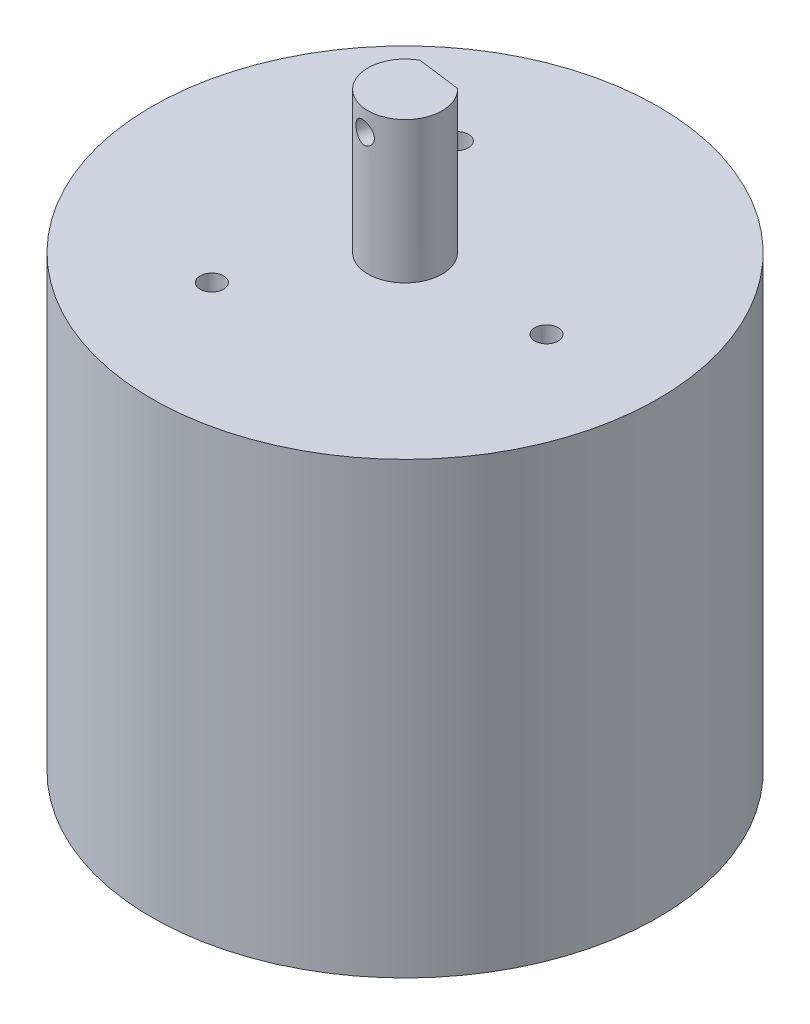
ISO-10303-21;
HEADER;
FILE_DESCRIPTION(('STEP AP214'),'2;1');
FILE_NAME('part.step','',(''),(''),'','','');
FILE_SCHEMA(('AUTOMOTIVE_DESIGN { 1 0 10303 214 1 1 1 1 }'));
ENDSEC;
DATA;
#1=APPLICATION_CONTEXT('core data for automotive mechanical design processes');
#2=APPLICATION_PROTOCOL_DEFINITION('international standard','automotive_design',2000,#1);
#3=PRODUCT_CONTEXT('',#1,'mechanical');
#4=PRODUCT('Part','Part','',(#3));
#5=PRODUCT_RELATED_PRODUCT_CATEGORY('part','',(#4));
#6=PRODUCT_DEFINITION_FORMATION('','',#4);
#7=PRODUCT_DEFINITION_CONTEXT('part definition',#1,'design');
#8=PRODUCT_DEFINITION('design','',#6,#7);
#9=PRODUCT_DEFINITION_SHAPE('','',#8);
#10=(LENGTH_UNIT() NAMED_UNIT(*) SI_UNIT(.MILLI.,.METRE.));
#11=(NAMED_UNIT(*) PLANE_ANGLE_UNIT() SI_UNIT($,.RADIAN.));
#12=(NAMED_UNIT(*) SI_UNIT($,.STERADIAN.) SOLID_ANGLE_UNIT());
#13=UNCERTAINTY_MEASURE_WITH_UNIT(LENGTH_MEASURE(1.E-05),#10,'distance_accuracy_value','');
#14=(GEOMETRIC_REPRESENTATION_CONTEXT(3) GLOBAL_UNCERTAINTY_ASSIGNED_CONTEXT((#13)) GLOBAL_UNIT_ASSIGNED_CONTEXT((#10,
#11,#12)) REPRESENTATION_CONTEXT('',''));
#15=CARTESIAN_POINT('',(0.,0.,0.));
#16=DIRECTION('',(0.,0.,1.));
#17=DIRECTION('',(1.,0.,0.));
#18=AXIS2_PLACEMENT_3D('',#15,#16,#17);
#19=CARTESIAN_POINT('',(-55.40494724416,-71.37599085876,49.5531694411));
#20=DIRECTION('',(0.,1.,0.));
#21=DIRECTION('',(-0.127904900041319,0.,0.991786436963836));
#22=AXIS2_PLACEMENT_3D('',#19,#20,#21);
#23=PLANE('',#22);
#24=CARTESIAN_POINT('',(-33.24092982825,-71.3759908587599,73.92100664979));
#25=DIRECTION('',(0.,1.,0.));
#26=DIRECTION('',(0.,0.,1.));
#27=AXIS2_PLACEMENT_3D('',#24,#25,#26);
#28=CIRCLE('',#27,1.64999999999993);
#29=CARTESIAN_POINT('',(-33.24092982825,-71.3759908587599,75.5710066497899));
#30=VERTEX_POINT('',#29);
#31=EDGE_CURVE('E228',#30,#30,#28,.F.);
#32=ORIENTED_EDGE('',*,*,#31,.F.);
#33=EDGE_LOOP('',(#32));
#34=FACE_BOUND('',#33,.T.);
#35=CARTESIAN_POINT('',(-3.240929828247,-71.3759908587599,91.24151472548));
#36=DIRECTION('',(0.,1.,0.));
#37=DIRECTION('',(0.,0.,1.));
#38=AXIS2_PLACEMENT_3D('',#35,#36,#37);
#39=CIRCLE('',#38,1.64999999999982);
#40=CARTESIAN_POINT('',(-3.240929828247,-71.3759908587599,92.8915147254798));
#41=VERTEX_POINT('',#40);
#42=EDGE_CURVE('E232',#41,#41,#39,.F.);
#43=ORIENTED_EDGE('',*,*,#42,.F.);
#44=EDGE_LOOP('',(#43));
#45=FACE_BOUND('',#44,.T.);
#46=CARTESIAN_POINT('',(-33.24092982825,-71.3759908587599,108.5620228012));
#47=DIRECTION('',(0.,1.,0.));
#48=DIRECTION('',(0.,0.,1.));
#49=AXIS2_PLACEMENT_3D('',#46,#47,#48);
#50=CIRCLE('',#49,1.65000000000984);
#51=CARTESIAN_POINT('',(-33.24092982825,-71.3759908587599,110.21202280121));
#52=VERTEX_POINT('',#51);
#53=EDGE_CURVE('E220',#52,#52,#50,.F.);
#54=ORIENTED_EDGE('',*,*,#53,.F.);
#55=EDGE_LOOP('',(#54));
#56=FACE_BOUND('',#55,.T.);
#57=CARTESIAN_POINT('',(-23.24092982825,-71.375990858758,91.24151472548));
#58=DIRECTION('',(0.,-1.,0.));
#59=DIRECTION('',(0.,0.,-1.));
#60=AXIS2_PLACEMENT_3D('',#57,#58,#59);
#61=CIRCLE('',#60,35.800000000006);
#62=CARTESIAN_POINT('',(-23.24092982825,-71.375990858758,55.441514725474));
#63=VERTEX_POINT('',#62);
#64=EDGE_CURVE('E20',#63,#63,#61,.T.);
#65=ORIENTED_EDGE('',*,*,#64,.T.);
#66=EDGE_LOOP('',(#65));
#67=FACE_BOUND('',#66,.T.);
#68=ADVANCED_FACE('F16',(#34,#45,#56,#67),#23,.F.);
#69=CARTESIAN_POINT('',(-23.24092982825,-7.87599085876005,91.24151472548));
#70=DIRECTION('',(0.,-1.,0.));
#71=DIRECTION('',(0.,0.,-1.));
#72=AXIS2_PLACEMENT_3D('',#69,#70,#71);
#73=CYLINDRICAL_SURFACE('',#72,35.800000000006);
#74=ORIENTED_EDGE('',*,*,#64,.F.);
#75=EDGE_LOOP('',(#74));
#76=FACE_BOUND('',#75,.T.);
#77=CARTESIAN_POINT('',(-23.24092982825,-7.87599085876005,91.24151472548));
#78=DIRECTION('',(0.,-1.,0.));
#79=DIRECTION('',(0.,0.,-1.));
#80=AXIS2_PLACEMENT_3D('',#77,#78,#79);
#81=CIRCLE('',#80,35.800000000006);
#82=CARTESIAN_POINT('',(-23.24092982825,-7.87599085876005,55.441514725474));
#83=VERTEX_POINT('',#82);
#84=EDGE_CURVE('E231',#83,#83,#81,.F.);
#85=ORIENTED_EDGE('',*,*,#84,.F.);
#86=EDGE_LOOP('',(#85));
#87=FACE_BOUND('',#86,.T.);
#88=ADVANCED_FACE('F100',(#76,#87),#73,.T.);
#89=CARTESIAN_POINT('',(-33.24092982825,-71.3759908587599,108.5620228012));
#90=DIRECTION('',(0.,1.,0.));
#91=DIRECTION('',(0.,0.,1.));
#92=AXIS2_PLACEMENT_3D('',#89,#90,#91);
#93=CYLINDRICAL_SURFACE('',#92,1.65000000000984);
#94=CARTESIAN_POINT('',(-33.24092982825,-7.87599085876202,108.5620228012));
#95=DIRECTION('',(0.,1.,0.));
#96=DIRECTION('',(0.,0.,1.));
#97=AXIS2_PLACEMENT_3D('',#94,#95,#96);
#98=CIRCLE('',#97,1.65000000000984);
#99=CARTESIAN_POINT('',(-33.24092982825,-7.87599085876202,110.21202280121));
#100=VERTEX_POINT('',#99);
#101=EDGE_CURVE('E235',#100,#100,#98,.F.);
#102=ORIENTED_EDGE('',*,*,#101,.F.);
#103=EDGE_LOOP('',(#102));
#104=FACE_BOUND('',#103,.T.);
#105=ORIENTED_EDGE('',*,*,#53,.T.);
#106=EDGE_LOOP('',(#105));
#107=FACE_BOUND('',#106,.T.);
#108=ADVANCED_FACE('F96',(#104,#107),#93,.F.);
#109=CARTESIAN_POINT('',(-3.240929828247,-71.3759908587599,91.24151472548));
#110=DIRECTION('',(0.,1.,0.));
#111=DIRECTION('',(0.,0.,1.));
#112=AXIS2_PLACEMENT_3D('',#109,#110,#111);
#113=CYLINDRICAL_SURFACE('',#112,1.64999999999982);
#114=CARTESIAN_POINT('',(-3.240929828247,-7.87599085876202,91.24151472548));
#115=DIRECTION('',(0.,1.,0.));
#116=DIRECTION('',(0.,0.,1.));
#117=AXIS2_PLACEMENT_3D('',#114,#115,#116);
#118=CIRCLE('',#117,1.64999999999982);
#119=CARTESIAN_POINT('',(-3.240929828247,-7.87599085876202,92.8915147254798));
#120=VERTEX_POINT('',#119);
#121=EDGE_CURVE('E223',#120,#120,#118,.F.);
#122=ORIENTED_EDGE('',*,*,#121,.F.);
#123=EDGE_LOOP('',(#122));
#124=FACE_BOUND('',#123,.T.);
#125=ORIENTED_EDGE('',*,*,#42,.T.);
#126=EDGE_LOOP('',(#125));
#127=FACE_BOUND('',#126,.T.);
#128=ADVANCED_FACE('F92',(#124,#127),#113,.F.);
#129=CARTESIAN_POINT('',(-33.24092982825,-71.3759908587599,73.92100664979));
#130=DIRECTION('',(0.,1.,0.));
#131=DIRECTION('',(0.,0.,1.));
#132=AXIS2_PLACEMENT_3D('',#129,#130,#131);
#133=CYLINDRICAL_SURFACE('',#132,1.64999999999993);
#134=CARTESIAN_POINT('',(-33.24092982825,-7.87599085876202,73.92100664979));
#135=DIRECTION('',(0.,1.,0.));
#136=DIRECTION('',(0.,0.,1.));
#137=AXIS2_PLACEMENT_3D('',#134,#135,#136);
#138=CIRCLE('',#137,1.64999999999993);
#139=CARTESIAN_POINT('',(-33.24092982825,-7.87599085876202,75.5710066497899));
#140=VERTEX_POINT('',#139);
#141=EDGE_CURVE('E57',#140,#140,#138,.F.);
#142=ORIENTED_EDGE('',*,*,#141,.F.);
#143=EDGE_LOOP('',(#142));
#144=FACE_BOUND('',#143,.T.);
#145=ORIENTED_EDGE('',*,*,#31,.T.);
#146=EDGE_LOOP('',(#145));
#147=FACE_BOUND('',#146,.T.);
#148=ADVANCED_FACE('F89',(#144,#147),#133,.F.);
#149=CARTESIAN_POINT('',(-25.76237683561,1.12400914124,85.46406127143));
#150=DIRECTION('',(0.,1.,0.));
#151=DIRECTION('',(-0.127904900040745,0.,0.99178643696391));
#152=AXIS2_PLACEMENT_3D('',#149,#150,#151);
#153=PLANE('',#152);
#154=CARTESIAN_POINT('',(-23.24092982825,1.12400914124048,91.24151472548));
#155=DIRECTION('',(0.,-1.,0.));
#156=DIRECTION('',(1.,0.,0.));
#157=AXIS2_PLACEMENT_3D('',#154,#155,#156);
#158=CIRCLE('',#157,5.25000000000024);
#159=CARTESIAN_POINT('',(-19.640442903089,1.12400914124048,87.4206517468131));
#160=VERTEX_POINT('',#159);
#161=CARTESIAN_POINT('',(-25.7542251030592,1.12400914124048,86.6321929899505));
#162=VERTEX_POINT('',#161);
#163=EDGE_CURVE('E46',#160,#162,#158,.F.);
#164=ORIENTED_EDGE('',*,*,#163,.T.);
#165=DIRECTION('',(0.991786436963883,0.,0.12790490004095));
#166=VECTOR('',#165,1.);
#167=CARTESIAN_POINT('',(-22.69733400307,1.12400914124,87.02642236838));
#168=LINE('',#167,#166);
#169=EDGE_CURVE('E43',#162,#160,#168,.T.);
#170=ORIENTED_EDGE('',*,*,#169,.T.);
#171=EDGE_LOOP('',(#164,#170));
#172=FACE_BOUND('',#171,.T.);
#173=ADVANCED_FACE('F47',(#172),#153,.T.);
#174=CARTESIAN_POINT('',(-55.40494724416,-7.87599085876,49.5531694411));
#175=DIRECTION('',(0.,1.,0.));
#176=DIRECTION('',(-0.127904900041319,0.,0.991786436963836));
#177=AXIS2_PLACEMENT_3D('',#174,#175,#176);
#178=PLANE('',#177);
#179=CARTESIAN_POINT('',(-23.24092982825,-7.87599085875937,91.24151472548));
#180=DIRECTION('',(0.,-1.,0.));
#181=DIRECTION('',(1.,0.,0.));
#182=AXIS2_PLACEMENT_3D('',#179,#180,#181);
#183=CIRCLE('',#182,5.25000000000024);
#184=CARTESIAN_POINT('',(-17.9909298282498,-7.87599085875937,91.24151472548));
#185=VERTEX_POINT('',#184);
#186=EDGE_CURVE('E51',#185,#185,#183,.T.);
#187=ORIENTED_EDGE('',*,*,#186,.T.);
#188=EDGE_LOOP('',(#187));
#189=FACE_BOUND('',#188,.T.);
#190=ORIENTED_EDGE('',*,*,#141,.T.);
#191=EDGE_LOOP('',(#190));
#192=FACE_BOUND('',#191,.T.);
#193=ORIENTED_EDGE('',*,*,#121,.T.);
#194=EDGE_LOOP('',(#193));
#195=FACE_BOUND('',#194,.T.);
#196=ORIENTED_EDGE('',*,*,#101,.T.);
#197=EDGE_LOOP('',(#196));
#198=FACE_BOUND('',#197,.T.);
#199=ORIENTED_EDGE('',*,*,#84,.T.);
#200=EDGE_LOOP('',(#199));
#201=FACE_BOUND('',#200,.T.);
#202=ADVANCED_FACE('F87',(#189,#192,#195,#198,#201),#178,.T.);
#203=CARTESIAN_POINT('',(-23.919827199805,9.12400914124,96.5057478000389));
#204=DIRECTION('',(0.127904900040506,0.,-0.991786436963941));
#205=DIRECTION('',(-0.991786436963941,0.,-0.127904900040506));
#206=AXIS2_PLACEMENT_3D('',#203,#204,#205);
#207=CYLINDRICAL_SURFACE('',#206,1.49999999999229);
#208=CARTESIAN_POINT('',(-23.9124305534711,7.62400914124771,96.4483935195398));
#209=CARTESIAN_POINT('',(-23.830681206036,7.62401268832213,96.4589339120277));
#210=CARTESIAN_POINT('',(-23.7486371855315,7.63082922837784,96.4675396281486));
#211=CARTESIAN_POINT('',(-23.5864145657326,7.65787058743694,96.4807687623584));
#212=CARTESIAN_POINT('',(-23.5062377756587,7.67810789293773,96.4853884626934));
#213=CARTESIAN_POINT('',(-23.3502245670046,7.73126711753421,96.4909566146677));
#214=CARTESIAN_POINT('',(-23.2743814115116,7.76416869702396,96.4919109263037));
#215=CARTESIAN_POINT('',(-23.1289614187456,7.8416486924477,96.4908249542543));
#216=CARTESIAN_POINT('',(-23.0593843881026,7.88622674788457,96.4887847630116));
#217=CARTESIAN_POINT('',(-22.9267374242475,7.98703008820563,96.4825356170054));
#218=CARTESIAN_POINT('',(-22.8638600800286,8.04350568246117,96.4782765586177));
#219=CARTESIAN_POINT('',(-22.7482435515938,8.16598210226627,96.4686682428806));
#220=CARTESIAN_POINT('',(-22.695507946124,8.23198627586364,96.4633186020609));
#221=CARTESIAN_POINT('',(-22.6007691534811,8.37328736740635,96.4525625773777));
#222=CARTESIAN_POINT('',(-22.5590080698772,8.44874701099172,96.4471572775461));
#223=CARTESIAN_POINT('',(-22.489133721415,8.60575194434647,96.4375284382655));
#224=CARTESIAN_POINT('',(-22.4610041470429,8.68728982625548,96.4333034891548));
#225=CARTESIAN_POINT('',(-22.4258202611356,8.82835427236846,96.4278718411997));
#226=CARTESIAN_POINT('',(-22.4149444042232,8.88693395633013,96.4261364446933));
#227=CARTESIAN_POINT('',(-22.4004127000303,9.00500434773169,96.4238004164776));
#228=CARTESIAN_POINT('',(-22.3967564498172,9.06449500414262,96.4231997214396));
#229=CARTESIAN_POINT('',(-22.3967632149041,9.2063578871721,96.423203562948));
#230=CARTESIAN_POINT('',(-22.4037727620716,9.28875158877595,96.424358957562));
#231=CARTESIAN_POINT('',(-22.4315527421031,9.45117330947798,96.4287681433165));
#232=CARTESIAN_POINT('',(-22.4523362968163,9.53119899666414,96.4320239353281));
#233=CARTESIAN_POINT('',(-22.5068454832097,9.68646604779645,96.4400118254849));
#234=CARTESIAN_POINT('',(-22.5405483942601,9.76171554211778,96.4447413291695));
#235=CARTESIAN_POINT('',(-22.6197748139246,9.90564456780804,96.4547914418306));
#236=CARTESIAN_POINT('',(-22.6652981421514,9.9743241994154,96.4601120417859));
#237=CARTESIAN_POINT('',(-22.7681536126213,10.105145998321,96.4704454564674));
#238=CARTESIAN_POINT('',(-22.8257614528032,10.1670723605562,96.4754467065314));
#239=CARTESIAN_POINT('',(-22.9504218694854,10.2807258213013,96.4838426164966));
#240=CARTESIAN_POINT('',(-23.0174774538094,10.3324496590574,96.4872367632471));
#241=CARTESIAN_POINT('',(-23.1605534731611,10.4251532760193,96.4913960406838));
#242=CARTESIAN_POINT('',(-23.2367199665682,10.4659103779349,96.4921100234506));
#243=CARTESIAN_POINT('',(-23.3947129705678,10.5340383133255,96.4898540353459));
#244=CARTESIAN_POINT('',(-23.4765327444623,10.5614247761928,96.4868883801643));
#245=CARTESIAN_POINT('',(-23.6177313740593,10.5956980641306,96.4782974134296));
#246=CARTESIAN_POINT('',(-23.6763029700291,10.6062951573147,96.4737657362082));
#247=CARTESIAN_POINT('',(-23.7940957885383,10.6204518102801,96.4626263528627));
#248=CARTESIAN_POINT('',(-23.8533169799163,10.6240117061675,96.4560187459054));
#249=CARTESIAN_POINT('',(-23.9941793064548,10.6240055941577,96.4378485176204));
#250=CARTESIAN_POINT('',(-24.0757222467964,10.6171890541019,96.4253573795242));
#251=CARTESIAN_POINT('',(-24.2359933979785,10.5901476950425,96.3969963769825));
#252=CARTESIAN_POINT('',(-24.3147189155683,10.5699103895416,96.3811233754407));
#253=CARTESIAN_POINT('',(-24.4670401655903,10.5167511649449,96.3469274344141));
#254=CARTESIAN_POINT('',(-24.54064390124,10.483849585455,96.3286084539775));
#255=CARTESIAN_POINT('',(-24.6810303291774,10.406369590031,96.2906636983139));
#256=CARTESIAN_POINT('',(-24.7478132319615,10.361791534594,96.2710379634454));
#257=CARTESIAN_POINT('',(-24.8745346137946,10.2609881942727,96.2313395978362));
#258=CARTESIAN_POINT('',(-24.9342740935079,10.204512600017,96.2112673643293));
#259=CARTESIAN_POINT('',(-25.0436700137523,10.0820361802116,96.1726405082251));
#260=CARTESIAN_POINT('',(-25.0933228953418,10.0160320066141,96.1540864226634));
#261=CARTESIAN_POINT('',(-25.1822330015232,9.87473091507113,96.1196462728788));
#262=CARTESIAN_POINT('',(-25.2212563190403,9.79927127148565,96.1038226809985));
#263=CARTESIAN_POINT('',(-25.2864015056507,9.6422663381307,96.0767811614336));
#264=CARTESIAN_POINT('',(-25.312538792978,9.56072845622159,96.0655577323452));
#265=CARTESIAN_POINT('',(-25.3451934295318,9.41966401010914,96.0513773466468));
#266=CARTESIAN_POINT('',(-25.3552731505518,9.36108432614812,96.0469394317345));
#267=CARTESIAN_POINT('',(-25.3687367165056,9.24301393474788,96.0409930171531));
#268=CARTESIAN_POINT('',(-25.3721209351214,9.18352327833761,96.0394843539999));
#269=CARTESIAN_POINT('',(-25.3721153660077,9.04166039530885,96.0394897861781));
#270=CARTESIAN_POINT('',(-25.3656283001597,8.95926669370504,96.0423857600885));
#271=CARTESIAN_POINT('',(-25.339875911119,8.79684497300309,96.0536987025995));
#272=CARTESIAN_POINT('',(-25.3205984030535,8.71681928581697,96.0621209357312));
#273=CARTESIAN_POINT('',(-25.2698993176983,8.56155223468472,96.0836769217804));
#274=CARTESIAN_POINT('',(-25.2384990593973,8.48630274036342,96.0968024007051));
#275=CARTESIAN_POINT('',(-25.1644146757771,8.3423737146732,96.1266241116042));
#276=CARTESIAN_POINT('',(-25.1217307226542,8.27369408306585,96.1433202890866));
#277=CARTESIAN_POINT('',(-25.024862291051,8.14287228416021,96.1794109280842));
#278=CARTESIAN_POINT('',(-24.9704082012275,8.08094592192498,96.1988641502883));
#279=CARTESIAN_POINT('',(-24.8519567047915,7.9672924611798,96.2386127827626));
#280=CARTESIAN_POINT('',(-24.7879562585785,7.91556862342363,96.258908459783));
#281=CARTESIAN_POINT('',(-24.6506168351075,7.82286500646162,96.2992312779255));
#282=CARTESIAN_POINT('',(-24.5771236017302,7.78210790454592,96.3192460009336));
#283=CARTESIAN_POINT('',(-24.4237276586908,7.71397996915507,96.3571480253412));
#284=CARTESIAN_POINT('',(-24.3438325602343,7.68659350628772,96.3750377920655));
#285=CARTESIAN_POINT('',(-24.2050742518409,7.65232021834978,96.4025512353481));
#286=CARTESIAN_POINT('',(-24.1472693531752,7.64172312516562,96.4130279544496));
#287=CARTESIAN_POINT('',(-24.0305044780448,7.62756647220009,96.4321381059242));
#288=CARTESIAN_POINT('',(-23.9715445568813,7.62400657631262,96.4407716263135));
#289=CARTESIAN_POINT('',(-23.9124305534711,7.62400914124771,96.4483935195398));
#290=B_SPLINE_CURVE_WITH_KNOTS('',3,(#208,#209,#210,#211,#212,#213,#214,#215,#216,#217,#218,
#219,#220,#221,#222,#223,#224,#225,#226,#227,#228,#229,#230,#231,#232,#233,#234,#235,#236,#237,
#238,#239,#240,#241,#242,#243,#244,#245,#246,#247,#248,#249,#250,#251,#252,#253,#254,#255,#256,
#257,#258,#259,#260,#261,#262,#263,#264,#265,#266,#267,#268,#269,#270,#271,#272,#273,#274,#275,
#276,#277,#278,#279,#280,#281,#282,#283,#284,#285,#286,#287,#288,#289),.UNSPECIFIED.,.T.,.F.,(4,
2,2,2,2,2,2,2,2,2,2,2,2,2,2,2,2,2,2,2,2,2,2,2,2,2,2,2,2,2,2,2,2,2,2,2,2,2,2,2,4),(0.,
0.24705616375463,0.49434250828198,0.741233341744041,0.988116553647475,1.24083301280446,
1.49363848580827,1.75162503694278,2.00930215147071,2.18769372006276,2.36607533218111,
2.61289907476535,2.85995829337197,3.10658499992663,3.3532079430209,3.60622852554585,
3.85932984355555,4.11723745527257,4.37484286390916,4.55350088314569,4.73215036922652,
4.9792065329813,5.22649287750879,5.473383710971,5.72026692287457,5.9729833820318,
6.22578885503584,6.48377540617049,6.74145252069856,6.91984408928862,7.09822570140497,
7.34504944398906,7.59210866259554,7.83873536915004,8.08535831224417,8.33837889476908,
8.59148021277874,8.84938782449592,9.10699323313268,9.28565125236895,9.46430073844952),.UNSPECIFIED.);
#291=CARTESIAN_POINT('',(-23.9124305534711,7.62400914124771,96.4483935195398));
#292=VERTEX_POINT('',#291);
#293=EDGE_CURVE('E73',#292,#292,#290,.T.);
#294=ORIENTED_EDGE('',*,*,#293,.T.);
#295=EDGE_LOOP('',(#294));
#296=FACE_BOUND('',#295,.T.);
#297=CARTESIAN_POINT('',(-22.6973340030839,9.12400914123995,87.0264223683728));
#298=DIRECTION('',(0.127904900040505,0.,-0.991786436963941));
#299=DIRECTION('',(-0.991786436963941,0.,-0.127904900040505));
#300=AXIS2_PLACEMENT_3D('',#297,#298,#299);
#301=CIRCLE('',#300,1.49999999999229);
#302=CARTESIAN_POINT('',(-24.1850136585222,9.12400914123995,86.834565018313));
#303=VERTEX_POINT('',#302);
#304=EDGE_CURVE('E56',#303,#303,#301,.T.);
#305=ORIENTED_EDGE('',*,*,#304,.T.);
#306=EDGE_LOOP('',(#305));
#307=FACE_BOUND('',#306,.T.);
#308=ADVANCED_FACE('F83',(#296,#307),#207,.F.);
#309=CARTESIAN_POINT('',(-25.91042606013,0.90400914124,86.61204866547));
#310=DIRECTION('',(-0.12790490004095,0.,0.991786436963883));
#311=DIRECTION('',(0.991786436963883,0.,0.12790490004095));
#312=AXIS2_PLACEMENT_3D('',#309,#310,#311);
#313=PLANE('',#312);
#314=ORIENTED_EDGE('',*,*,#304,.F.);
#315=EDGE_LOOP('',(#314));
#316=FACE_BOUND('',#315,.T.);
#317=ORIENTED_EDGE('',*,*,#169,.F.);
#318=DIRECTION('',(0.,1.,0.));
#319=VECTOR('',#318,1.);
#320=CARTESIAN_POINT('',(-25.7542251030609,2.12400914124,86.6321929899515));
#321=LINE('',#320,#319);
#322=CARTESIAN_POINT('',(-25.7542251030561,12.12400914124,86.6321929899489));
#323=VERTEX_POINT('',#322);
#324=EDGE_CURVE('E36',#162,#323,#321,.T.);
#325=ORIENTED_EDGE('',*,*,#324,.T.);
#326=DIRECTION('',(-0.991786436963742,0.,-0.127904900042044));
#327=VECTOR('',#326,1.);
#328=CARTESIAN_POINT('',(-22.6973335687329,12.12400914124,87.0264224243932));
#329=LINE('',#328,#327);
#330=CARTESIAN_POINT('',(-19.6404429030874,12.12400914124,87.4206517468146));
#331=VERTEX_POINT('',#330);
#332=EDGE_CURVE('E27',#331,#323,#329,.T.);
#333=ORIENTED_EDGE('',*,*,#332,.F.);
#334=DIRECTION('',(0.,-1.,0.));
#335=VECTOR('',#334,1.);
#336=CARTESIAN_POINT('',(-19.6404429030847,2.12400914124,87.4206517468172));
#337=LINE('',#336,#335);
#338=EDGE_CURVE('E52',#331,#160,#337,.T.);
#339=ORIENTED_EDGE('',*,*,#338,.T.);
#340=EDGE_LOOP('',(#317,#325,#333,#339));
#341=FACE_BOUND('',#340,.T.);
#342=ADVANCED_FACE('F54',(#316,#341),#313,.F.);
#343=CARTESIAN_POINT('',(-23.24092982825,12.12400914124,91.24151472548));
#344=DIRECTION('',(0.,-1.,0.));
#345=DIRECTION('',(1.,0.,0.));
#346=AXIS2_PLACEMENT_3D('',#343,#344,#345);
#347=CYLINDRICAL_SURFACE('',#346,5.25000000000024);
#348=ORIENTED_EDGE('',*,*,#186,.F.);
#349=EDGE_LOOP('',(#348));
#350=FACE_BOUND('',#349,.T.);
#351=ORIENTED_EDGE('',*,*,#293,.F.);
#352=EDGE_LOOP('',(#351));
#353=FACE_BOUND('',#352,.T.);
#354=ORIENTED_EDGE('',*,*,#324,.F.);
#355=ORIENTED_EDGE('',*,*,#163,.F.);
#356=ORIENTED_EDGE('',*,*,#338,.F.);
#357=CARTESIAN_POINT('',(-23.24092982825,12.12400914124,91.24151472548));
#358=DIRECTION('',(0.,-1.,0.));
#359=DIRECTION('',(1.,0.,0.));
#360=AXIS2_PLACEMENT_3D('',#357,#358,#359);
#361=CIRCLE('',#360,5.25000000000024);
#362=EDGE_CURVE('E11',#323,#331,#361,.F.);
#363=ORIENTED_EDGE('',*,*,#362,.F.);
#364=EDGE_LOOP('',(#354,#355,#356,#363));
#365=FACE_BOUND('',#364,.T.);
#366=ADVANCED_FACE('F59',(#350,#353,#365),#347,.T.);
#367=CARTESIAN_POINT('',(-28.08875409369,12.12400914124,86.13954892971));
#368=DIRECTION('',(0.,1.,0.));
#369=DIRECTION('',(-0.127904900041401,0.,0.991786436963825));
#370=AXIS2_PLACEMENT_3D('',#367,#368,#369);
#371=PLANE('',#370);
#372=ORIENTED_EDGE('',*,*,#362,.T.);
#373=ORIENTED_EDGE('',*,*,#332,.T.);
#374=EDGE_LOOP('',(#372,#373));
#375=FACE_BOUND('',#374,.T.);
#376=ADVANCED_FACE('F18',(#375),#371,.T.);
#377=CLOSED_SHELL('',(#68,#88,#108,#128,#148,#173,#202,#308,#342,#366,#376));
#378=MANIFOLD_SOLID_BREP('B1',#377);
#379=ADVANCED_BREP_SHAPE_REPRESENTATION('',(#18,#378),#14);
#380=SHAPE_DEFINITION_REPRESENTATION(#9,#379);
ENDSEC;
END-ISO-10303-21;
